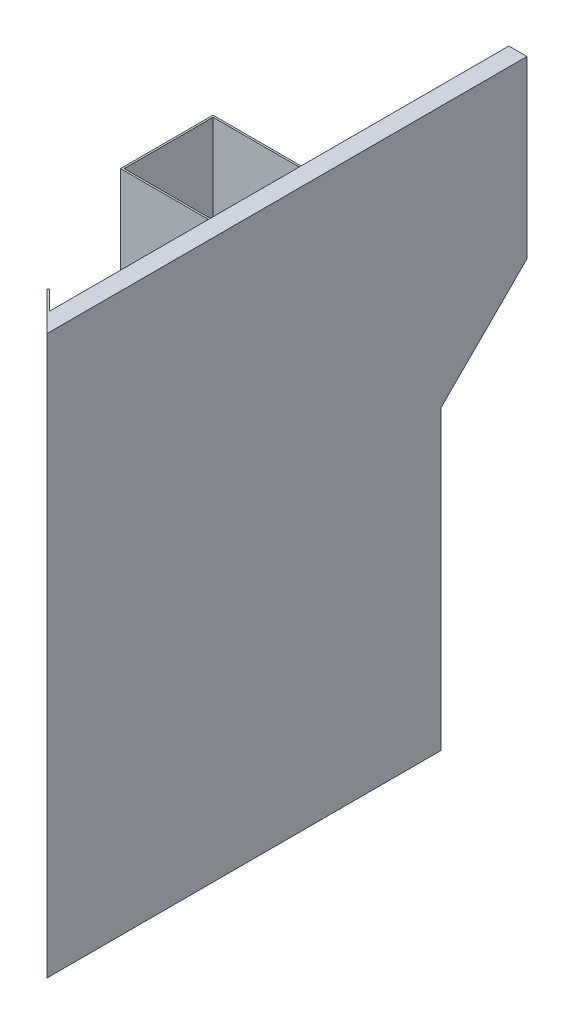
ISO-10303-21;
HEADER;
FILE_DESCRIPTION(('STEP AP214'),'2;1');
FILE_NAME('part.step','',(''),(''),'','','');
FILE_SCHEMA(('AUTOMOTIVE_DESIGN { 1 0 10303 214 1 1 1 1 }'));
ENDSEC;
DATA;
#1=APPLICATION_CONTEXT('core data for automotive mechanical design processes');
#2=APPLICATION_PROTOCOL_DEFINITION('international standard','automotive_design',2000,#1);
#3=PRODUCT_CONTEXT('',#1,'mechanical');
#4=PRODUCT('Part','Part','',(#3));
#5=PRODUCT_RELATED_PRODUCT_CATEGORY('part','',(#4));
#6=PRODUCT_DEFINITION_FORMATION('','',#4);
#7=PRODUCT_DEFINITION_CONTEXT('part definition',#1,'design');
#8=PRODUCT_DEFINITION('design','',#6,#7);
#9=PRODUCT_DEFINITION_SHAPE('','',#8);
#10=(LENGTH_UNIT() NAMED_UNIT(*) SI_UNIT(.MILLI.,.METRE.));
#11=(NAMED_UNIT(*) PLANE_ANGLE_UNIT() SI_UNIT($,.RADIAN.));
#12=(NAMED_UNIT(*) SI_UNIT($,.STERADIAN.) SOLID_ANGLE_UNIT());
#13=UNCERTAINTY_MEASURE_WITH_UNIT(LENGTH_MEASURE(1.E-05),#10,'distance_accuracy_value','');
#14=(GEOMETRIC_REPRESENTATION_CONTEXT(3) GLOBAL_UNCERTAINTY_ASSIGNED_CONTEXT((#13)) GLOBAL_UNIT_ASSIGNED_CONTEXT((#10,
#11,#12)) REPRESENTATION_CONTEXT('',''));
#15=CARTESIAN_POINT('',(0.,0.,0.));
#16=DIRECTION('',(0.,0.,1.));
#17=DIRECTION('',(1.,0.,0.));
#18=AXIS2_PLACEMENT_3D('',#15,#16,#17);
#19=CARTESIAN_POINT('',(24.,-43.5,-2.));
#20=DIRECTION('',(0.,-1.,0.));
#21=DIRECTION('',(1.,0.,0.));
#22=AXIS2_PLACEMENT_3D('',#19,#20,#21);
#23=PLANE('',#22);
#24=DIRECTION('',(1.,0.,0.));
#25=VECTOR('',#24,1.);
#26=CARTESIAN_POINT('',(720.,-43.5,493.));
#27=LINE('',#26,#25);
#28=CARTESIAN_POINT('',(720.,-43.5,493.));
#29=VERTEX_POINT('',#28);
#30=CARTESIAN_POINT('',(722.,-43.5,493.));
#31=VERTEX_POINT('',#30);
#32=EDGE_CURVE('E245',#29,#31,#27,.T.);
#33=ORIENTED_EDGE('',*,*,#32,.F.);
#34=DIRECTION('',(0.,0.,1.));
#35=VECTOR('',#34,1.);
#36=CARTESIAN_POINT('',(720.,-43.5,474.));
#37=LINE('',#36,#35);
#38=CARTESIAN_POINT('',(720.,-43.5,474.));
#39=VERTEX_POINT('',#38);
#40=EDGE_CURVE('E36',#39,#29,#37,.T.);
#41=ORIENTED_EDGE('',*,*,#40,.F.);
#42=DIRECTION('',(1.,0.,0.));
#43=VECTOR('',#42,1.);
#44=CARTESIAN_POINT('',(592.,-43.5,474.));
#45=LINE('',#44,#43);
#46=CARTESIAN_POINT('',(592.,-43.5,474.));
#47=VERTEX_POINT('',#46);
#48=EDGE_CURVE('E230',#47,#39,#45,.T.);
#49=ORIENTED_EDGE('',*,*,#48,.F.);
#50=DIRECTION('',(0.,0.,1.));
#51=VECTOR('',#50,1.);
#52=CARTESIAN_POINT('',(592.,-43.5,372.));
#53=LINE('',#52,#51);
#54=CARTESIAN_POINT('',(592.,-43.5,372.));
#55=VERTEX_POINT('',#54);
#56=EDGE_CURVE('E281',#55,#47,#53,.T.);
#57=ORIENTED_EDGE('',*,*,#56,.F.);
#58=DIRECTION('',(-1.,0.,0.));
#59=VECTOR('',#58,1.);
#60=CARTESIAN_POINT('',(720.,-43.5,372.));
#61=LINE('',#60,#59);
#62=CARTESIAN_POINT('',(720.,-43.5,372.));
#63=VERTEX_POINT('',#62);
#64=EDGE_CURVE('E282',#63,#55,#61,.T.);
#65=ORIENTED_EDGE('',*,*,#64,.F.);
#66=DIRECTION('',(0.,0.,1.));
#67=VECTOR('',#66,1.);
#68=CARTESIAN_POINT('',(720.,-43.5,353.));
#69=LINE('',#68,#67);
#70=CARTESIAN_POINT('',(720.,-43.5,353.));
#71=VERTEX_POINT('',#70);
#72=EDGE_CURVE('E286',#71,#63,#69,.T.);
#73=ORIENTED_EDGE('',*,*,#72,.F.);
#74=DIRECTION('',(-1.,0.,0.));
#75=VECTOR('',#74,1.);
#76=CARTESIAN_POINT('',(722.,-43.5,353.));
#77=LINE('',#76,#75);
#78=CARTESIAN_POINT('',(722.,-43.5,353.));
#79=VERTEX_POINT('',#78);
#80=EDGE_CURVE('E309',#79,#71,#77,.T.);
#81=ORIENTED_EDGE('',*,*,#80,.F.);
#82=DIRECTION('',(0.,0.,1.));
#83=VECTOR('',#82,1.);
#84=CARTESIAN_POINT('',(722.,-43.5,253.));
#85=LINE('',#84,#83);
#86=CARTESIAN_POINT('',(722.,-43.5,253.));
#87=VERTEX_POINT('',#86);
#88=EDGE_CURVE('E294',#87,#79,#85,.T.);
#89=ORIENTED_EDGE('',*,*,#88,.F.);
#90=DIRECTION('',(1.,0.,0.));
#91=VECTOR('',#90,1.);
#92=CARTESIAN_POINT('',(722.,-43.5,253.));
#93=LINE('',#92,#91);
#94=CARTESIAN_POINT('',(724.,-43.5,253.));
#95=VERTEX_POINT('',#94);
#96=EDGE_CURVE('E11',#87,#95,#93,.T.);
#97=ORIENTED_EDGE('',*,*,#96,.T.);
#98=DIRECTION('',(0.,0.,1.));
#99=VECTOR('',#98,1.);
#100=CARTESIAN_POINT('',(724.,-43.5,253.));
#101=LINE('',#100,#99);
#102=CARTESIAN_POINT('',(724.,-43.5,687.));
#103=VERTEX_POINT('',#102);
#104=EDGE_CURVE('E27',#95,#103,#101,.T.);
#105=ORIENTED_EDGE('',*,*,#104,.T.);
#106=DIRECTION('',(-0.707106781186548,0.,-0.707106781186548));
#107=VECTOR('',#106,1.);
#108=CARTESIAN_POINT('',(724.,-43.5,687.));
#109=LINE('',#108,#107);
#110=CARTESIAN_POINT('',(681.5735931288,-43.5,644.5735931288));
#111=VERTEX_POINT('',#110);
#112=EDGE_CURVE('E206',#103,#111,#109,.T.);
#113=ORIENTED_EDGE('',*,*,#112,.T.);
#114=DIRECTION('',(0.707106781186498,0.,-0.707106781186598));
#115=VECTOR('',#114,1.);
#116=CARTESIAN_POINT('',(681.5735931288,-43.5,644.5735931288));
#117=LINE('',#116,#115);
#118=CARTESIAN_POINT('',(682.9878066912,-43.5,643.1593795664));
#119=VERTEX_POINT('',#118);
#120=EDGE_CURVE('E320',#111,#119,#117,.T.);
#121=ORIENTED_EDGE('',*,*,#120,.T.);
#122=DIRECTION('',(0.707106781186548,0.,0.707106781186548));
#123=VECTOR('',#122,1.);
#124=CARTESIAN_POINT('',(682.9878066912,-43.5,643.1593795664));
#125=LINE('',#124,#123);
#126=CARTESIAN_POINT('',(722.,-43.5,682.1715728753));
#127=VERTEX_POINT('',#126);
#128=EDGE_CURVE('E317',#119,#127,#125,.T.);
#129=ORIENTED_EDGE('',*,*,#128,.T.);
#130=DIRECTION('',(0.,0.,-1.));
#131=VECTOR('',#130,1.);
#132=CARTESIAN_POINT('',(722.,-43.5,682.1715728753));
#133=LINE('',#132,#131);
#134=EDGE_CURVE('E321',#127,#31,#133,.T.);
#135=ORIENTED_EDGE('',*,*,#134,.T.);
#136=EDGE_LOOP('',(#33,#41,#49,#57,#65,#73,#81,#89,#97,#105,#113,#121,#129,#135));
#137=FACE_BOUND('',#136,.T.);
#138=DIRECTION('',(1.,0.,0.));
#139=VECTOR('',#138,1.);
#140=CARTESIAN_POINT('',(594.,-43.5,374.));
#141=LINE('',#140,#139);
#142=CARTESIAN_POINT('',(594.,-43.5,374.));
#143=VERTEX_POINT('',#142);
#144=CARTESIAN_POINT('',(722.,-43.5,374.));
#145=VERTEX_POINT('',#144);
#146=EDGE_CURVE('E186',#143,#145,#141,.T.);
#147=ORIENTED_EDGE('',*,*,#146,.F.);
#148=DIRECTION('',(0.,0.,-1.));
#149=VECTOR('',#148,1.);
#150=CARTESIAN_POINT('',(594.,-43.5,472.));
#151=LINE('',#150,#149);
#152=CARTESIAN_POINT('',(594.,-43.5,472.));
#153=VERTEX_POINT('',#152);
#154=EDGE_CURVE('E21',#153,#143,#151,.T.);
#155=ORIENTED_EDGE('',*,*,#154,.F.);
#156=DIRECTION('',(-1.,0.,0.));
#157=VECTOR('',#156,1.);
#158=CARTESIAN_POINT('',(722.,-43.5,472.));
#159=LINE('',#158,#157);
#160=CARTESIAN_POINT('',(722.,-43.5,472.));
#161=VERTEX_POINT('',#160);
#162=EDGE_CURVE('E203',#161,#153,#159,.T.);
#163=ORIENTED_EDGE('',*,*,#162,.F.);
#164=DIRECTION('',(0.,0.,1.));
#165=VECTOR('',#164,1.);
#166=CARTESIAN_POINT('',(722.,-43.5,374.));
#167=LINE('',#166,#165);
#168=EDGE_CURVE('E302',#145,#161,#167,.T.);
#169=ORIENTED_EDGE('',*,*,#168,.F.);
#170=EDGE_LOOP('',(#147,#155,#163,#169));
#171=FACE_BOUND('',#170,.T.);
#172=ADVANCED_FACE('F17',(#137,#171),#23,.T.);
#173=CARTESIAN_POINT('',(722.,-43.5,158.));
#174=DIRECTION('',(1.,0.,0.));
#175=DIRECTION('',(0.,1.,0.));
#176=AXIS2_PLACEMENT_3D('',#173,#174,#175);
#177=PLANE('',#176);
#178=DIRECTION('',(0.,1.,0.));
#179=VECTOR('',#178,1.);
#180=CARTESIAN_POINT('',(722.,378.5,158.));
#181=LINE('',#180,#179);
#182=CARTESIAN_POINT('',(722.,378.5,158.));
#183=VERTEX_POINT('',#182);
#184=CARTESIAN_POINT('',(722.,569.5,158.));
#185=VERTEX_POINT('',#184);
#186=EDGE_CURVE('E215',#183,#185,#181,.T.);
#187=ORIENTED_EDGE('',*,*,#186,.F.);
#188=DIRECTION('',(0.,-0.707106781186548,0.707106781186548));
#189=VECTOR('',#188,1.);
#190=CARTESIAN_POINT('',(722.,378.5,158.));
#191=LINE('',#190,#189);
#192=CARTESIAN_POINT('',(722.,283.5,253.));
#193=VERTEX_POINT('',#192);
#194=EDGE_CURVE('E293',#183,#193,#191,.T.);
#195=ORIENTED_EDGE('',*,*,#194,.T.);
#196=DIRECTION('',(0.,-1.,0.));
#197=VECTOR('',#196,1.);
#198=CARTESIAN_POINT('',(722.,283.5,253.));
#199=LINE('',#198,#197);
#200=EDGE_CURVE('E290',#193,#87,#199,.T.);
#201=ORIENTED_EDGE('',*,*,#200,.T.);
#202=ORIENTED_EDGE('',*,*,#88,.T.);
#203=DIRECTION('',(0.,1.,0.));
#204=VECTOR('',#203,1.);
#205=CARTESIAN_POINT('',(722.,-43.5,353.));
#206=LINE('',#205,#204);
#207=CARTESIAN_POINT('',(722.,556.5,353.));
#208=VERTEX_POINT('',#207);
#209=EDGE_CURVE('E264',#79,#208,#206,.T.);
#210=ORIENTED_EDGE('',*,*,#209,.T.);
#211=DIRECTION('',(0.,0.,1.));
#212=VECTOR('',#211,1.);
#213=CARTESIAN_POINT('',(722.,556.5,353.));
#214=LINE('',#213,#212);
#215=CARTESIAN_POINT('',(722.,556.5,374.));
#216=VERTEX_POINT('',#215);
#217=EDGE_CURVE('E305',#208,#216,#214,.T.);
#218=ORIENTED_EDGE('',*,*,#217,.T.);
#219=DIRECTION('',(0.,1.,0.));
#220=VECTOR('',#219,1.);
#221=CARTESIAN_POINT('',(722.,-43.5,374.));
#222=LINE('',#221,#220);
#223=EDGE_CURVE('E181',#145,#216,#222,.T.);
#224=ORIENTED_EDGE('',*,*,#223,.F.);
#225=ORIENTED_EDGE('',*,*,#168,.T.);
#226=DIRECTION('',(0.,1.,0.));
#227=VECTOR('',#226,1.);
#228=CARTESIAN_POINT('',(722.,-43.5,472.));
#229=LINE('',#228,#227);
#230=CARTESIAN_POINT('',(722.,556.5,472.));
#231=VERTEX_POINT('',#230);
#232=EDGE_CURVE('E306',#161,#231,#229,.T.);
#233=ORIENTED_EDGE('',*,*,#232,.T.);
#234=DIRECTION('',(0.,0.,1.));
#235=VECTOR('',#234,1.);
#236=CARTESIAN_POINT('',(722.,556.5,472.));
#237=LINE('',#236,#235);
#238=CARTESIAN_POINT('',(722.,556.5,493.));
#239=VERTEX_POINT('',#238);
#240=EDGE_CURVE('E250',#231,#239,#237,.T.);
#241=ORIENTED_EDGE('',*,*,#240,.T.);
#242=DIRECTION('',(0.,1.,0.));
#243=VECTOR('',#242,1.);
#244=CARTESIAN_POINT('',(722.,-43.5,493.));
#245=LINE('',#244,#243);
#246=EDGE_CURVE('E243',#31,#239,#245,.T.);
#247=ORIENTED_EDGE('',*,*,#246,.F.);
#248=ORIENTED_EDGE('',*,*,#134,.F.);
#249=DIRECTION('',(0.,1.,0.));
#250=VECTOR('',#249,1.);
#251=CARTESIAN_POINT('',(722.,-43.5,682.1715728753));
#252=LINE('',#251,#250);
#253=CARTESIAN_POINT('',(722.,569.5,682.1715728753));
#254=VERTEX_POINT('',#253);
#255=EDGE_CURVE('E324',#127,#254,#252,.T.);
#256=ORIENTED_EDGE('',*,*,#255,.T.);
#257=DIRECTION('',(0.,0.,-1.));
#258=VECTOR('',#257,1.);
#259=CARTESIAN_POINT('',(722.,569.5,682.1715728753));
#260=LINE('',#259,#258);
#261=EDGE_CURVE('E275',#254,#185,#260,.T.);
#262=ORIENTED_EDGE('',*,*,#261,.T.);
#263=EDGE_LOOP('',(#187,#195,#201,#202,#210,#218,#224,#225,#233,#241,#247,#248,#256,#262));
#264=FACE_BOUND('',#263,.T.);
#265=ADVANCED_FACE('F371',(#264),#177,.F.);
#266=CARTESIAN_POINT('',(24.,569.5,-2.00000000000004));
#267=DIRECTION('',(0.,-1.,0.));
#268=DIRECTION('',(1.,0.,0.));
#269=AXIS2_PLACEMENT_3D('',#266,#267,#268);
#270=PLANE('',#269);
#271=DIRECTION('',(1.,0.,0.));
#272=VECTOR('',#271,1.);
#273=CARTESIAN_POINT('',(704.,569.5,158.));
#274=LINE('',#273,#272);
#275=CARTESIAN_POINT('',(704.,569.5,158.));
#276=VERTEX_POINT('',#275);
#277=EDGE_CURVE('E273',#276,#185,#274,.T.);
#278=ORIENTED_EDGE('',*,*,#277,.T.);
#279=ORIENTED_EDGE('',*,*,#261,.F.);
#280=DIRECTION('',(-0.707106781186548,0.,-0.707106781186548));
#281=VECTOR('',#280,1.);
#282=CARTESIAN_POINT('',(722.,569.5,682.1715728753));
#283=LINE('',#282,#281);
#284=CARTESIAN_POINT('',(704.,569.5,664.1715728753));
#285=VERTEX_POINT('',#284);
#286=EDGE_CURVE('E211',#254,#285,#283,.T.);
#287=ORIENTED_EDGE('',*,*,#286,.T.);
#288=DIRECTION('',(0.,0.,1.));
#289=VECTOR('',#288,1.);
#290=CARTESIAN_POINT('',(704.,569.5,158.));
#291=LINE('',#290,#289);
#292=EDGE_CURVE('E100',#276,#285,#291,.T.);
#293=ORIENTED_EDGE('',*,*,#292,.F.);
#294=EDGE_LOOP('',(#278,#279,#287,#293));
#295=FACE_BOUND('',#294,.T.);
#296=ADVANCED_FACE('F406',(#295),#270,.T.);
#297=CARTESIAN_POINT('',(704.,571.5,628.));
#298=DIRECTION('',(1.,0.,0.));
#299=DIRECTION('',(0.,1.,0.));
#300=AXIS2_PLACEMENT_3D('',#297,#298,#299);
#301=PLANE('',#300);
#302=DIRECTION('',(0.,-1.,0.));
#303=VECTOR('',#302,1.);
#304=CARTESIAN_POINT('',(704.,571.5,158.));
#305=LINE('',#304,#303);
#306=CARTESIAN_POINT('',(704.,571.5,158.));
#307=VERTEX_POINT('',#306);
#308=EDGE_CURVE('E208',#307,#276,#305,.T.);
#309=ORIENTED_EDGE('',*,*,#308,.T.);
#310=ORIENTED_EDGE('',*,*,#292,.T.);
#311=DIRECTION('',(0.,-1.,0.));
#312=VECTOR('',#311,1.);
#313=CARTESIAN_POINT('',(704.,571.5,664.1715728753));
#314=LINE('',#313,#312);
#315=CARTESIAN_POINT('',(704.,571.5,664.1715728753));
#316=VERTEX_POINT('',#315);
#317=EDGE_CURVE('E106',#316,#285,#314,.T.);
#318=ORIENTED_EDGE('',*,*,#317,.F.);
#319=DIRECTION('',(0.,0.,1.));
#320=VECTOR('',#319,1.);
#321=CARTESIAN_POINT('',(704.,571.5,158.));
#322=LINE('',#321,#320);
#323=EDGE_CURVE('E253',#307,#316,#322,.T.);
#324=ORIENTED_EDGE('',*,*,#323,.F.);
#325=EDGE_LOOP('',(#309,#310,#318,#324));
#326=FACE_BOUND('',#325,.T.);
#327=ADVANCED_FACE('F430',(#326),#301,.F.);
#328=CARTESIAN_POINT('',(24.,571.5,-2.00000000000004));
#329=DIRECTION('',(0.,-1.,0.));
#330=DIRECTION('',(1.,0.,0.));
#331=AXIS2_PLACEMENT_3D('',#328,#329,#330);
#332=PLANE('',#331);
#333=DIRECTION('',(0.707106781186498,0.,-0.707106781186598));
#334=VECTOR('',#333,1.);
#335=CARTESIAN_POINT('',(681.5735931288,571.5,644.5735931288));
#336=LINE('',#335,#334);
#337=CARTESIAN_POINT('',(681.5735931288,571.5,644.5735931288));
#338=VERTEX_POINT('',#337);
#339=CARTESIAN_POINT('',(682.9878066912,571.5,643.1593795664));
#340=VERTEX_POINT('',#339);
#341=EDGE_CURVE('E228',#338,#340,#336,.T.);
#342=ORIENTED_EDGE('',*,*,#341,.F.);
#343=DIRECTION('',(-0.707106781186548,0.,-0.707106781186548));
#344=VECTOR('',#343,1.);
#345=CARTESIAN_POINT('',(724.,571.5,687.));
#346=LINE('',#345,#344);
#347=CARTESIAN_POINT('',(724.,571.5,687.));
#348=VERTEX_POINT('',#347);
#349=EDGE_CURVE('E229',#348,#338,#346,.T.);
#350=ORIENTED_EDGE('',*,*,#349,.F.);
#351=DIRECTION('',(0.,0.,1.));
#352=VECTOR('',#351,1.);
#353=CARTESIAN_POINT('',(724.,571.5,158.));
#354=LINE('',#353,#352);
#355=CARTESIAN_POINT('',(724.,571.5,158.));
#356=VERTEX_POINT('',#355);
#357=EDGE_CURVE('E214',#356,#348,#354,.T.);
#358=ORIENTED_EDGE('',*,*,#357,.F.);
#359=DIRECTION('',(1.,0.,0.));
#360=VECTOR('',#359,1.);
#361=CARTESIAN_POINT('',(704.,571.5,158.));
#362=LINE('',#361,#360);
#363=EDGE_CURVE('E212',#307,#356,#362,.T.);
#364=ORIENTED_EDGE('',*,*,#363,.F.);
#365=ORIENTED_EDGE('',*,*,#323,.T.);
#366=DIRECTION('',(0.707106781186548,0.,0.707106781186548));
#367=VECTOR('',#366,1.);
#368=CARTESIAN_POINT('',(682.9878066912,571.5,643.1593795664));
#369=LINE('',#368,#367);
#370=EDGE_CURVE('E254',#340,#316,#369,.T.);
#371=ORIENTED_EDGE('',*,*,#370,.F.);
#372=EDGE_LOOP('',(#342,#350,#358,#364,#365,#371));
#373=FACE_BOUND('',#372,.T.);
#374=ADVANCED_FACE('F433',(#373),#332,.F.);
#375=CARTESIAN_POINT('',(682.9878066912,-43.5,643.1593795664));
#376=DIRECTION('',(0.707106781186548,0.,-0.707106781186548));
#377=DIRECTION('',(0.,-1.,0.));
#378=AXIS2_PLACEMENT_3D('',#375,#376,#377);
#379=PLANE('',#378);
#380=ORIENTED_EDGE('',*,*,#255,.F.);
#381=ORIENTED_EDGE('',*,*,#128,.F.);
#382=DIRECTION('',(0.,1.,0.));
#383=VECTOR('',#382,1.);
#384=CARTESIAN_POINT('',(682.9878066912,-43.5,643.1593795664));
#385=LINE('',#384,#383);
#386=EDGE_CURVE('E251',#119,#340,#385,.T.);
#387=ORIENTED_EDGE('',*,*,#386,.T.);
#388=ORIENTED_EDGE('',*,*,#370,.T.);
#389=ORIENTED_EDGE('',*,*,#317,.T.);
#390=ORIENTED_EDGE('',*,*,#286,.F.);
#391=EDGE_LOOP('',(#380,#381,#387,#388,#389,#390));
#392=FACE_BOUND('',#391,.T.);
#393=ADVANCED_FACE('F429',(#392),#379,.T.);
#394=CARTESIAN_POINT('',(681.5735931288,-43.5,644.5735931288));
#395=DIRECTION('',(-0.707106781186548,0.,-0.707106781186548));
#396=DIRECTION('',(0.707106781186548,0.,-0.707106781186548));
#397=AXIS2_PLACEMENT_3D('',#394,#395,#396);
#398=PLANE('',#397);
#399=DIRECTION('',(0.,1.,0.));
#400=VECTOR('',#399,1.);
#401=CARTESIAN_POINT('',(681.5735931288,-43.5,644.5735931288));
#402=LINE('',#401,#400);
#403=EDGE_CURVE('E261',#111,#338,#402,.T.);
#404=ORIENTED_EDGE('',*,*,#403,.T.);
#405=ORIENTED_EDGE('',*,*,#341,.T.);
#406=ORIENTED_EDGE('',*,*,#386,.F.);
#407=ORIENTED_EDGE('',*,*,#120,.F.);
#408=EDGE_LOOP('',(#404,#405,#406,#407));
#409=FACE_BOUND('',#408,.T.);
#410=ADVANCED_FACE('F438',(#409),#398,.T.);
#411=CARTESIAN_POINT('',(724.,-43.5,687.));
#412=DIRECTION('',(-0.707106781186548,0.,0.707106781186548));
#413=DIRECTION('',(0.,-1.,0.));
#414=AXIS2_PLACEMENT_3D('',#411,#412,#413);
#415=PLANE('',#414);
#416=DIRECTION('',(0.,1.,0.));
#417=VECTOR('',#416,1.);
#418=CARTESIAN_POINT('',(724.,-43.5,687.));
#419=LINE('',#418,#417);
#420=EDGE_CURVE('E225',#103,#348,#419,.T.);
#421=ORIENTED_EDGE('',*,*,#420,.T.);
#422=ORIENTED_EDGE('',*,*,#349,.T.);
#423=ORIENTED_EDGE('',*,*,#403,.F.);
#424=ORIENTED_EDGE('',*,*,#112,.F.);
#425=EDGE_LOOP('',(#421,#422,#423,#424));
#426=FACE_BOUND('',#425,.T.);
#427=ADVANCED_FACE('F436',(#426),#415,.T.);
#428=CARTESIAN_POINT('',(724.,-43.5,158.));
#429=DIRECTION('',(1.,0.,0.));
#430=DIRECTION('',(0.,1.,0.));
#431=AXIS2_PLACEMENT_3D('',#428,#429,#430);
#432=PLANE('',#431);
#433=DIRECTION('',(0.,1.,0.));
#434=VECTOR('',#433,1.);
#435=CARTESIAN_POINT('',(724.,-43.5,253.));
#436=LINE('',#435,#434);
#437=CARTESIAN_POINT('',(724.,283.5,253.));
#438=VERTEX_POINT('',#437);
#439=EDGE_CURVE('E236',#95,#438,#436,.T.);
#440=ORIENTED_EDGE('',*,*,#439,.T.);
#441=DIRECTION('',(0.,-0.707106781186548,0.707106781186548));
#442=VECTOR('',#441,1.);
#443=CARTESIAN_POINT('',(724.,378.5,158.));
#444=LINE('',#443,#442);
#445=CARTESIAN_POINT('',(724.,378.5,158.));
#446=VERTEX_POINT('',#445);
#447=EDGE_CURVE('E216',#446,#438,#444,.T.);
#448=ORIENTED_EDGE('',*,*,#447,.F.);
#449=DIRECTION('',(0.,1.,0.));
#450=VECTOR('',#449,1.);
#451=CARTESIAN_POINT('',(724.,378.5,158.));
#452=LINE('',#451,#450);
#453=EDGE_CURVE('E239',#446,#356,#452,.T.);
#454=ORIENTED_EDGE('',*,*,#453,.T.);
#455=ORIENTED_EDGE('',*,*,#357,.T.);
#456=ORIENTED_EDGE('',*,*,#420,.F.);
#457=ORIENTED_EDGE('',*,*,#104,.F.);
#458=EDGE_LOOP('',(#440,#448,#454,#455,#456,#457));
#459=FACE_BOUND('',#458,.T.);
#460=ADVANCED_FACE('F382',(#459),#432,.T.);
#461=CARTESIAN_POINT('',(654.,-43.5,158.));
#462=DIRECTION('',(0.,0.,-1.));
#463=DIRECTION('',(-1.,0.,0.));
#464=AXIS2_PLACEMENT_3D('',#461,#462,#463);
#465=PLANE('',#464);
#466=ORIENTED_EDGE('',*,*,#363,.T.);
#467=ORIENTED_EDGE('',*,*,#453,.F.);
#468=DIRECTION('',(1.,0.,0.));
#469=VECTOR('',#468,1.);
#470=CARTESIAN_POINT('',(722.,378.5,158.));
#471=LINE('',#470,#469);
#472=EDGE_CURVE('E218',#183,#446,#471,.T.);
#473=ORIENTED_EDGE('',*,*,#472,.F.);
#474=ORIENTED_EDGE('',*,*,#186,.T.);
#475=ORIENTED_EDGE('',*,*,#277,.F.);
#476=ORIENTED_EDGE('',*,*,#308,.F.);
#477=EDGE_LOOP('',(#466,#467,#473,#474,#475,#476));
#478=FACE_BOUND('',#477,.T.);
#479=ADVANCED_FACE('F19',(#478),#465,.T.);
#480=CARTESIAN_POINT('',(724.,538.5,-2.00000000000004));
#481=DIRECTION('',(0.,0.707106781186548,0.707106781186548));
#482=DIRECTION('',(-1.,0.,0.));
#483=AXIS2_PLACEMENT_3D('',#480,#481,#482);
#484=PLANE('',#483);
#485=ORIENTED_EDGE('',*,*,#472,.T.);
#486=ORIENTED_EDGE('',*,*,#447,.T.);
#487=DIRECTION('',(-1.,0.,0.));
#488=VECTOR('',#487,1.);
#489=CARTESIAN_POINT('',(724.,283.5,253.));
#490=LINE('',#489,#488);
#491=EDGE_CURVE('E219',#438,#193,#490,.T.);
#492=ORIENTED_EDGE('',*,*,#491,.T.);
#493=ORIENTED_EDGE('',*,*,#194,.F.);
#494=EDGE_LOOP('',(#485,#486,#492,#493));
#495=FACE_BOUND('',#494,.T.);
#496=ADVANCED_FACE('F389',(#495),#484,.F.);
#497=CARTESIAN_POINT('',(724.,283.5,253.));
#498=DIRECTION('',(0.,0.,1.));
#499=DIRECTION('',(0.,1.,0.));
#500=AXIS2_PLACEMENT_3D('',#497,#498,#499);
#501=PLANE('',#500);
#502=ORIENTED_EDGE('',*,*,#491,.F.);
#503=ORIENTED_EDGE('',*,*,#439,.F.);
#504=ORIENTED_EDGE('',*,*,#96,.F.);
#505=ORIENTED_EDGE('',*,*,#200,.F.);
#506=EDGE_LOOP('',(#502,#503,#504,#505));
#507=FACE_BOUND('',#506,.T.);
#508=ADVANCED_FACE('F375',(#507),#501,.F.);
#509=CARTESIAN_POINT('',(720.,-43.5,493.));
#510=DIRECTION('',(0.,0.,1.));
#511=DIRECTION('',(0.,1.,0.));
#512=AXIS2_PLACEMENT_3D('',#509,#510,#511);
#513=PLANE('',#512);
#514=DIRECTION('',(1.,0.,0.));
#515=VECTOR('',#514,1.);
#516=CARTESIAN_POINT('',(720.,556.5,493.));
#517=LINE('',#516,#515);
#518=CARTESIAN_POINT('',(720.,556.5,493.));
#519=VERTEX_POINT('',#518);
#520=EDGE_CURVE('E235',#519,#239,#517,.T.);
#521=ORIENTED_EDGE('',*,*,#520,.F.);
#522=DIRECTION('',(0.,1.,0.));
#523=VECTOR('',#522,1.);
#524=CARTESIAN_POINT('',(720.,-43.5,493.));
#525=LINE('',#524,#523);
#526=EDGE_CURVE('E242',#29,#519,#525,.T.);
#527=ORIENTED_EDGE('',*,*,#526,.F.);
#528=ORIENTED_EDGE('',*,*,#32,.T.);
#529=ORIENTED_EDGE('',*,*,#246,.T.);
#530=EDGE_LOOP('',(#521,#527,#528,#529));
#531=FACE_BOUND('',#530,.T.);
#532=ADVANCED_FACE('F397',(#531),#513,.T.);
#533=CARTESIAN_POINT('',(720.,-43.5,474.));
#534=DIRECTION('',(-1.,0.,0.));
#535=DIRECTION('',(0.,0.,-1.));
#536=AXIS2_PLACEMENT_3D('',#533,#534,#535);
#537=PLANE('',#536);
#538=ORIENTED_EDGE('',*,*,#526,.T.);
#539=DIRECTION('',(0.,0.,1.));
#540=VECTOR('',#539,1.);
#541=CARTESIAN_POINT('',(720.,556.5,474.));
#542=LINE('',#541,#540);
#543=CARTESIAN_POINT('',(720.,556.5,474.));
#544=VERTEX_POINT('',#543);
#545=EDGE_CURVE('E137',#544,#519,#542,.T.);
#546=ORIENTED_EDGE('',*,*,#545,.F.);
#547=DIRECTION('',(0.,1.,0.));
#548=VECTOR('',#547,1.);
#549=CARTESIAN_POINT('',(720.,-43.5,474.));
#550=LINE('',#549,#548);
#551=EDGE_CURVE('E232',#39,#544,#550,.T.);
#552=ORIENTED_EDGE('',*,*,#551,.F.);
#553=ORIENTED_EDGE('',*,*,#40,.T.);
#554=EDGE_LOOP('',(#538,#546,#552,#553));
#555=FACE_BOUND('',#554,.T.);
#556=ADVANCED_FACE('F415',(#555),#537,.T.);
#557=CARTESIAN_POINT('',(592.,-43.5,474.));
#558=DIRECTION('',(0.,0.,1.));
#559=DIRECTION('',(0.,1.,0.));
#560=AXIS2_PLACEMENT_3D('',#557,#558,#559);
#561=PLANE('',#560);
#562=ORIENTED_EDGE('',*,*,#551,.T.);
#563=DIRECTION('',(1.,0.,0.));
#564=VECTOR('',#563,1.);
#565=CARTESIAN_POINT('',(592.,556.5,474.));
#566=LINE('',#565,#564);
#567=CARTESIAN_POINT('',(592.,556.5,474.));
#568=VERTEX_POINT('',#567);
#569=EDGE_CURVE('E146',#568,#544,#566,.T.);
#570=ORIENTED_EDGE('',*,*,#569,.F.);
#571=DIRECTION('',(0.,1.,0.));
#572=VECTOR('',#571,1.);
#573=CARTESIAN_POINT('',(592.,-43.5,474.));
#574=LINE('',#573,#572);
#575=EDGE_CURVE('E233',#47,#568,#574,.T.);
#576=ORIENTED_EDGE('',*,*,#575,.F.);
#577=ORIENTED_EDGE('',*,*,#48,.T.);
#578=EDGE_LOOP('',(#562,#570,#576,#577));
#579=FACE_BOUND('',#578,.T.);
#580=ADVANCED_FACE('F455',(#579),#561,.T.);
#581=CARTESIAN_POINT('',(592.,-43.5,372.));
#582=DIRECTION('',(-1.,0.,0.));
#583=DIRECTION('',(0.,0.,-1.));
#584=AXIS2_PLACEMENT_3D('',#581,#582,#583);
#585=PLANE('',#584);
#586=ORIENTED_EDGE('',*,*,#575,.T.);
#587=DIRECTION('',(0.,0.,1.));
#588=VECTOR('',#587,1.);
#589=CARTESIAN_POINT('',(592.,556.5,372.));
#590=LINE('',#589,#588);
#591=CARTESIAN_POINT('',(592.,556.5,372.));
#592=VERTEX_POINT('',#591);
#593=EDGE_CURVE('E267',#592,#568,#590,.T.);
#594=ORIENTED_EDGE('',*,*,#593,.F.);
#595=DIRECTION('',(0.,1.,0.));
#596=VECTOR('',#595,1.);
#597=CARTESIAN_POINT('',(592.,-43.5,372.));
#598=LINE('',#597,#596);
#599=EDGE_CURVE('E278',#55,#592,#598,.T.);
#600=ORIENTED_EDGE('',*,*,#599,.F.);
#601=ORIENTED_EDGE('',*,*,#56,.T.);
#602=EDGE_LOOP('',(#586,#594,#600,#601));
#603=FACE_BOUND('',#602,.T.);
#604=ADVANCED_FACE('F413',(#603),#585,.T.);
#605=CARTESIAN_POINT('',(720.,-43.5,372.));
#606=DIRECTION('',(0.,0.,-1.));
#607=DIRECTION('',(-1.,0.,0.));
#608=AXIS2_PLACEMENT_3D('',#605,#606,#607);
#609=PLANE('',#608);
#610=ORIENTED_EDGE('',*,*,#599,.T.);
#611=DIRECTION('',(-1.,0.,0.));
#612=VECTOR('',#611,1.);
#613=CARTESIAN_POINT('',(720.,556.5,372.));
#614=LINE('',#613,#612);
#615=CARTESIAN_POINT('',(720.,556.5,372.));
#616=VERTEX_POINT('',#615);
#617=EDGE_CURVE('E270',#616,#592,#614,.T.);
#618=ORIENTED_EDGE('',*,*,#617,.F.);
#619=DIRECTION('',(0.,1.,0.));
#620=VECTOR('',#619,1.);
#621=CARTESIAN_POINT('',(720.,-43.5,372.));
#622=LINE('',#621,#620);
#623=EDGE_CURVE('E283',#63,#616,#622,.T.);
#624=ORIENTED_EDGE('',*,*,#623,.F.);
#625=ORIENTED_EDGE('',*,*,#64,.T.);
#626=EDGE_LOOP('',(#610,#618,#624,#625));
#627=FACE_BOUND('',#626,.T.);
#628=ADVANCED_FACE('F363',(#627),#609,.T.);
#629=CARTESIAN_POINT('',(720.,-43.5,353.));
#630=DIRECTION('',(-1.,0.,0.));
#631=DIRECTION('',(0.,0.,-1.));
#632=AXIS2_PLACEMENT_3D('',#629,#630,#631);
#633=PLANE('',#632);
#634=ORIENTED_EDGE('',*,*,#623,.T.);
#635=DIRECTION('',(0.,0.,1.));
#636=VECTOR('',#635,1.);
#637=CARTESIAN_POINT('',(720.,556.5,353.));
#638=LINE('',#637,#636);
#639=CARTESIAN_POINT('',(720.,556.5,353.));
#640=VERTEX_POINT('',#639);
#641=EDGE_CURVE('E223',#640,#616,#638,.T.);
#642=ORIENTED_EDGE('',*,*,#641,.F.);
#643=DIRECTION('',(0.,1.,0.));
#644=VECTOR('',#643,1.);
#645=CARTESIAN_POINT('',(720.,-43.5,353.));
#646=LINE('',#645,#644);
#647=EDGE_CURVE('E222',#71,#640,#646,.T.);
#648=ORIENTED_EDGE('',*,*,#647,.F.);
#649=ORIENTED_EDGE('',*,*,#72,.T.);
#650=EDGE_LOOP('',(#634,#642,#648,#649));
#651=FACE_BOUND('',#650,.T.);
#652=ADVANCED_FACE('F356',(#651),#633,.T.);
#653=CARTESIAN_POINT('',(722.,-43.5,353.));
#654=DIRECTION('',(0.,0.,-1.));
#655=DIRECTION('',(-1.,0.,0.));
#656=AXIS2_PLACEMENT_3D('',#653,#654,#655);
#657=PLANE('',#656);
#658=ORIENTED_EDGE('',*,*,#80,.T.);
#659=ORIENTED_EDGE('',*,*,#647,.T.);
#660=DIRECTION('',(-1.,0.,0.));
#661=VECTOR('',#660,1.);
#662=CARTESIAN_POINT('',(722.,556.5,353.));
#663=LINE('',#662,#661);
#664=EDGE_CURVE('E220',#208,#640,#663,.T.);
#665=ORIENTED_EDGE('',*,*,#664,.F.);
#666=ORIENTED_EDGE('',*,*,#209,.F.);
#667=EDGE_LOOP('',(#658,#659,#665,#666));
#668=FACE_BOUND('',#667,.T.);
#669=ADVANCED_FACE('F366',(#668),#657,.T.);
#670=CARTESIAN_POINT('',(24.,556.5,-2.00000000000004));
#671=DIRECTION('',(0.,1.,0.));
#672=DIRECTION('',(0.,0.,1.));
#673=AXIS2_PLACEMENT_3D('',#670,#671,#672);
#674=PLANE('',#673);
#675=ORIENTED_EDGE('',*,*,#664,.T.);
#676=ORIENTED_EDGE('',*,*,#641,.T.);
#677=ORIENTED_EDGE('',*,*,#617,.T.);
#678=ORIENTED_EDGE('',*,*,#593,.T.);
#679=ORIENTED_EDGE('',*,*,#569,.T.);
#680=ORIENTED_EDGE('',*,*,#545,.T.);
#681=ORIENTED_EDGE('',*,*,#520,.T.);
#682=ORIENTED_EDGE('',*,*,#240,.F.);
#683=DIRECTION('',(-1.,0.,0.));
#684=VECTOR('',#683,1.);
#685=CARTESIAN_POINT('',(722.,556.5,472.));
#686=LINE('',#685,#684);
#687=CARTESIAN_POINT('',(594.,556.5,472.));
#688=VERTEX_POINT('',#687);
#689=EDGE_CURVE('E192',#231,#688,#686,.T.);
#690=ORIENTED_EDGE('',*,*,#689,.T.);
#691=DIRECTION('',(0.,0.,-1.));
#692=VECTOR('',#691,1.);
#693=CARTESIAN_POINT('',(594.,556.5,472.));
#694=LINE('',#693,#692);
#695=CARTESIAN_POINT('',(594.,556.5,374.));
#696=VERTEX_POINT('',#695);
#697=EDGE_CURVE('E185',#688,#696,#694,.T.);
#698=ORIENTED_EDGE('',*,*,#697,.T.);
#699=DIRECTION('',(1.,0.,0.));
#700=VECTOR('',#699,1.);
#701=CARTESIAN_POINT('',(594.,556.5,374.));
#702=LINE('',#701,#700);
#703=EDGE_CURVE('E175',#696,#216,#702,.T.);
#704=ORIENTED_EDGE('',*,*,#703,.T.);
#705=ORIENTED_EDGE('',*,*,#217,.F.);
#706=EDGE_LOOP('',(#675,#676,#677,#678,#679,#680,#681,#682,#690,#698,#704,#705));
#707=FACE_BOUND('',#706,.T.);
#708=ADVANCED_FACE('F190',(#707),#674,.T.);
#709=CARTESIAN_POINT('',(594.,-43.5,374.));
#710=DIRECTION('',(0.,0.,1.));
#711=DIRECTION('',(0.,1.,0.));
#712=AXIS2_PLACEMENT_3D('',#709,#710,#711);
#713=PLANE('',#712);
#714=ORIENTED_EDGE('',*,*,#703,.F.);
#715=DIRECTION('',(0.,1.,0.));
#716=VECTOR('',#715,1.);
#717=CARTESIAN_POINT('',(594.,-43.5,374.));
#718=LINE('',#717,#716);
#719=EDGE_CURVE('E179',#143,#696,#718,.T.);
#720=ORIENTED_EDGE('',*,*,#719,.F.);
#721=ORIENTED_EDGE('',*,*,#146,.T.);
#722=ORIENTED_EDGE('',*,*,#223,.T.);
#723=EDGE_LOOP('',(#714,#720,#721,#722));
#724=FACE_BOUND('',#723,.T.);
#725=ADVANCED_FACE('F177',(#724),#713,.T.);
#726=CARTESIAN_POINT('',(594.,-43.5,472.));
#727=DIRECTION('',(1.,0.,0.));
#728=DIRECTION('',(0.,1.,0.));
#729=AXIS2_PLACEMENT_3D('',#726,#727,#728);
#730=PLANE('',#729);
#731=ORIENTED_EDGE('',*,*,#719,.T.);
#732=ORIENTED_EDGE('',*,*,#697,.F.);
#733=DIRECTION('',(0.,1.,0.));
#734=VECTOR('',#733,1.);
#735=CARTESIAN_POINT('',(594.,-43.5,472.));
#736=LINE('',#735,#734);
#737=EDGE_CURVE('E241',#153,#688,#736,.T.);
#738=ORIENTED_EDGE('',*,*,#737,.F.);
#739=ORIENTED_EDGE('',*,*,#154,.T.);
#740=EDGE_LOOP('',(#731,#732,#738,#739));
#741=FACE_BOUND('',#740,.T.);
#742=ADVANCED_FACE('F198',(#741),#730,.T.);
#743=CARTESIAN_POINT('',(722.,-43.5,472.));
#744=DIRECTION('',(0.,0.,-1.));
#745=DIRECTION('',(-1.,0.,0.));
#746=AXIS2_PLACEMENT_3D('',#743,#744,#745);
#747=PLANE('',#746);
#748=ORIENTED_EDGE('',*,*,#162,.T.);
#749=ORIENTED_EDGE('',*,*,#737,.T.);
#750=ORIENTED_EDGE('',*,*,#689,.F.);
#751=ORIENTED_EDGE('',*,*,#232,.F.);
#752=EDGE_LOOP('',(#748,#749,#750,#751));
#753=FACE_BOUND('',#752,.T.);
#754=ADVANCED_FACE('F417',(#753),#747,.T.);
#755=CLOSED_SHELL('',(#172,#265,#296,#327,#374,#393,#410,#427,#460,#479,#496,#508,#532,#556,
#580,#604,#628,#652,#669,#708,#725,#742,#754));
#756=MANIFOLD_SOLID_BREP('B1',#755);
#757=ADVANCED_BREP_SHAPE_REPRESENTATION('',(#18,#756),#14);
#758=SHAPE_DEFINITION_REPRESENTATION(#9,#757);
ENDSEC;
END-ISO-10303-21;
